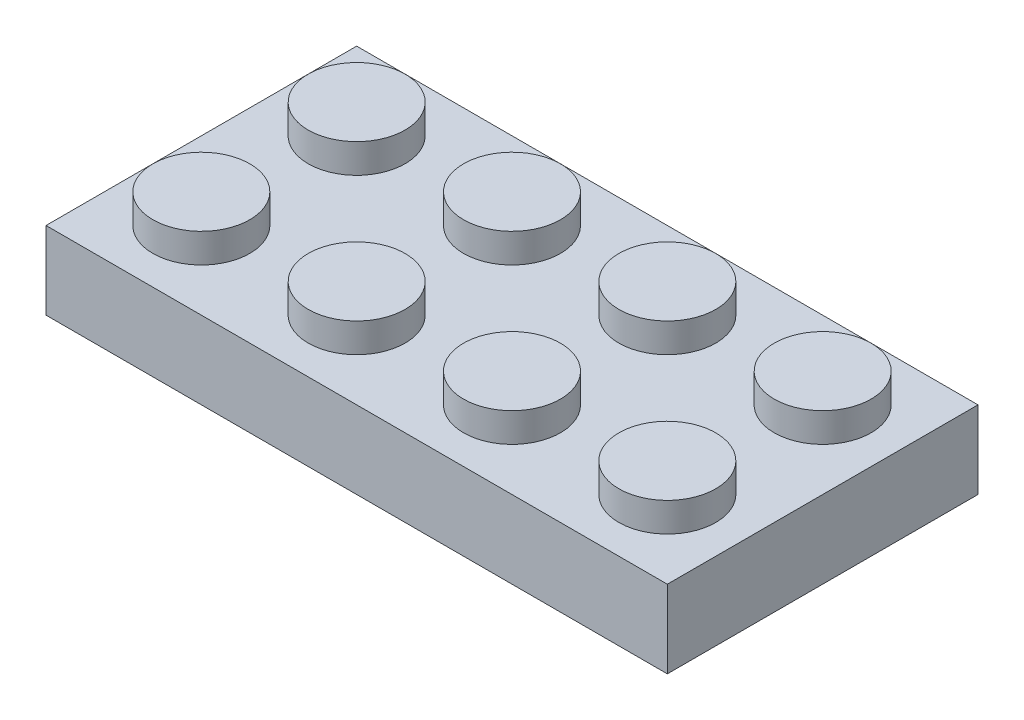
ISO-10303-21;
HEADER;
FILE_DESCRIPTION(('STEP AP214'),'2;1');
FILE_NAME('part.step','',(''),(''),'','','');
FILE_SCHEMA(('AUTOMOTIVE_DESIGN { 1 0 10303 214 1 1 1 1 }'));
ENDSEC;
DATA;
#1=APPLICATION_CONTEXT('core data for automotive mechanical design processes');
#2=APPLICATION_PROTOCOL_DEFINITION('international standard','automotive_design',2000,#1);
#3=PRODUCT_CONTEXT('',#1,'mechanical');
#4=PRODUCT('Part','Part','',(#3));
#5=PRODUCT_RELATED_PRODUCT_CATEGORY('part','',(#4));
#6=PRODUCT_DEFINITION_FORMATION('','',#4);
#7=PRODUCT_DEFINITION_CONTEXT('part definition',#1,'design');
#8=PRODUCT_DEFINITION('design','',#6,#7);
#9=PRODUCT_DEFINITION_SHAPE('','',#8);
#10=(LENGTH_UNIT() NAMED_UNIT(*) SI_UNIT(.MILLI.,.METRE.));
#11=(NAMED_UNIT(*) PLANE_ANGLE_UNIT() SI_UNIT($,.RADIAN.));
#12=(NAMED_UNIT(*) SI_UNIT($,.STERADIAN.) SOLID_ANGLE_UNIT());
#13=UNCERTAINTY_MEASURE_WITH_UNIT(LENGTH_MEASURE(1.E-05),#10,'distance_accuracy_value','');
#14=(GEOMETRIC_REPRESENTATION_CONTEXT(3) GLOBAL_UNCERTAINTY_ASSIGNED_CONTEXT((#13)) GLOBAL_UNIT_ASSIGNED_CONTEXT((#10,
#11,#12)) REPRESENTATION_CONTEXT('',''));
#15=CARTESIAN_POINT('',(0.,0.,0.));
#16=DIRECTION('',(0.,0.,1.));
#17=DIRECTION('',(1.,0.,0.));
#18=AXIS2_PLACEMENT_3D('',#15,#16,#17);
#19=CARTESIAN_POINT('',(0.,1.9812,0.));
#20=DIRECTION('',(0.,1.,0.));
#21=DIRECTION('',(0.,0.,1.));
#22=AXIS2_PLACEMENT_3D('',#19,#20,#21);
#23=PLANE('',#22);
#24=CARTESIAN_POINT('',(-9.525,1.9812,-3.175));
#25=DIRECTION('',(0.,1.,0.));
#26=DIRECTION('',(0.,0.,1.));
#27=AXIS2_PLACEMENT_3D('',#24,#25,#26);
#28=CIRCLE('',#27,0.7874);
#29=CARTESIAN_POINT('',(-9.525,1.9812,-2.3876));
#30=VERTEX_POINT('',#29);
#31=EDGE_CURVE('E173',#30,#30,#28,.T.);
#32=ORIENTED_EDGE('',*,*,#31,.T.);
#33=EDGE_LOOP('',(#32));
#34=FACE_BOUND('',#33,.T.);
#35=DIRECTION('',(0.,0.,1.));
#36=VECTOR('',#35,1.);
#37=CARTESIAN_POINT('',(-11.5062,1.9812,6.35));
#38=LINE('',#37,#36);
#39=CARTESIAN_POINT('',(-11.5062,1.9812,-5.1562));
#40=VERTEX_POINT('',#39);
#41=CARTESIAN_POINT('',(-11.5062,1.9812,5.1562));
#42=VERTEX_POINT('',#41);
#43=EDGE_CURVE('E123',#40,#42,#38,.T.);
#44=ORIENTED_EDGE('',*,*,#43,.F.);
#45=DIRECTION('',(-1.,0.,0.));
#46=VECTOR('',#45,1.);
#47=CARTESIAN_POINT('',(12.7,1.9812,-5.1562));
#48=LINE('',#47,#46);
#49=CARTESIAN_POINT('',(11.5062,1.9812,-5.1562));
#50=VERTEX_POINT('',#49);
#51=EDGE_CURVE('E131',#50,#40,#48,.T.);
#52=ORIENTED_EDGE('',*,*,#51,.F.);
#53=DIRECTION('',(0.,0.,-1.));
#54=VECTOR('',#53,1.);
#55=CARTESIAN_POINT('',(11.5062,1.9812,6.35));
#56=LINE('',#55,#54);
#57=CARTESIAN_POINT('',(11.5062,1.9812,5.1562));
#58=VERTEX_POINT('',#57);
#59=EDGE_CURVE('E122',#58,#50,#56,.T.);
#60=ORIENTED_EDGE('',*,*,#59,.F.);
#61=DIRECTION('',(1.,0.,0.));
#62=VECTOR('',#61,1.);
#63=CARTESIAN_POINT('',(12.7,1.9812,5.1562));
#64=LINE('',#63,#62);
#65=EDGE_CURVE('E112',#42,#58,#64,.T.);
#66=ORIENTED_EDGE('',*,*,#65,.F.);
#67=EDGE_LOOP('',(#44,#52,#60,#66));
#68=FACE_BOUND('',#67,.T.);
#69=CARTESIAN_POINT('',(-3.175,1.9812,-3.175));
#70=DIRECTION('',(0.,1.,0.));
#71=DIRECTION('',(0.,0.,1.));
#72=AXIS2_PLACEMENT_3D('',#69,#70,#71);
#73=CIRCLE('',#72,0.7874);
#74=CARTESIAN_POINT('',(-3.175,1.9812,-2.3876));
#75=VERTEX_POINT('',#74);
#76=EDGE_CURVE('E137',#75,#75,#73,.T.);
#77=ORIENTED_EDGE('',*,*,#76,.T.);
#78=EDGE_LOOP('',(#77));
#79=FACE_BOUND('',#78,.T.);
#80=CARTESIAN_POINT('',(3.175,1.9812,-3.175));
#81=DIRECTION('',(0.,1.,0.));
#82=DIRECTION('',(0.,0.,1.));
#83=AXIS2_PLACEMENT_3D('',#80,#81,#82);
#84=CIRCLE('',#83,0.7874);
#85=CARTESIAN_POINT('',(3.175,1.9812,-2.3876));
#86=VERTEX_POINT('',#85);
#87=EDGE_CURVE('E142',#86,#86,#84,.T.);
#88=ORIENTED_EDGE('',*,*,#87,.T.);
#89=EDGE_LOOP('',(#88));
#90=FACE_BOUND('',#89,.T.);
#91=CARTESIAN_POINT('',(9.525,1.9812,-3.175));
#92=DIRECTION('',(0.,1.,0.));
#93=DIRECTION('',(0.,0.,1.));
#94=AXIS2_PLACEMENT_3D('',#91,#92,#93);
#95=CIRCLE('',#94,0.7874);
#96=CARTESIAN_POINT('',(9.525,1.9812,-2.3876));
#97=VERTEX_POINT('',#96);
#98=EDGE_CURVE('E146',#97,#97,#95,.T.);
#99=ORIENTED_EDGE('',*,*,#98,.T.);
#100=EDGE_LOOP('',(#99));
#101=FACE_BOUND('',#100,.T.);
#102=CARTESIAN_POINT('',(-9.525,1.9812,3.175));
#103=DIRECTION('',(0.,1.,0.));
#104=DIRECTION('',(0.,0.,1.));
#105=AXIS2_PLACEMENT_3D('',#102,#103,#104);
#106=CIRCLE('',#105,0.7874);
#107=CARTESIAN_POINT('',(-9.525,1.9812,3.9624));
#108=VERTEX_POINT('',#107);
#109=EDGE_CURVE('E150',#108,#108,#106,.T.);
#110=ORIENTED_EDGE('',*,*,#109,.T.);
#111=EDGE_LOOP('',(#110));
#112=FACE_BOUND('',#111,.T.);
#113=CARTESIAN_POINT('',(-3.175,1.9812,3.175));
#114=DIRECTION('',(0.,1.,0.));
#115=DIRECTION('',(0.,0.,1.));
#116=AXIS2_PLACEMENT_3D('',#113,#114,#115);
#117=CIRCLE('',#116,0.7874);
#118=CARTESIAN_POINT('',(-3.175,1.9812,3.9624));
#119=VERTEX_POINT('',#118);
#120=EDGE_CURVE('E154',#119,#119,#117,.T.);
#121=ORIENTED_EDGE('',*,*,#120,.T.);
#122=EDGE_LOOP('',(#121));
#123=FACE_BOUND('',#122,.T.);
#124=CARTESIAN_POINT('',(3.175,1.9812,3.175));
#125=DIRECTION('',(0.,1.,0.));
#126=DIRECTION('',(0.,0.,1.));
#127=AXIS2_PLACEMENT_3D('',#124,#125,#126);
#128=CIRCLE('',#127,0.7874);
#129=CARTESIAN_POINT('',(3.175,1.9812,3.9624));
#130=VERTEX_POINT('',#129);
#131=EDGE_CURVE('E158',#130,#130,#128,.T.);
#132=ORIENTED_EDGE('',*,*,#131,.T.);
#133=EDGE_LOOP('',(#132));
#134=FACE_BOUND('',#133,.T.);
#135=CARTESIAN_POINT('',(9.525,1.9812,3.17499999999999));
#136=DIRECTION('',(0.,1.,0.));
#137=DIRECTION('',(0.,0.,1.));
#138=AXIS2_PLACEMENT_3D('',#135,#136,#137);
#139=CIRCLE('',#138,0.7874);
#140=CARTESIAN_POINT('',(9.525,1.9812,3.96239999999999));
#141=VERTEX_POINT('',#140);
#142=EDGE_CURVE('E162',#141,#141,#139,.T.);
#143=ORIENTED_EDGE('',*,*,#142,.T.);
#144=EDGE_LOOP('',(#143));
#145=FACE_BOUND('',#144,.T.);
#146=CARTESIAN_POINT('',(6.35,1.9812,0.));
#147=DIRECTION('',(0.,1.,0.));
#148=DIRECTION('',(0.,0.,1.));
#149=AXIS2_PLACEMENT_3D('',#146,#147,#148);
#150=CIRCLE('',#149,2.5019);
#151=CARTESIAN_POINT('',(6.35,1.9812,2.5019));
#152=VERTEX_POINT('',#151);
#153=EDGE_CURVE('E267',#152,#152,#150,.F.);
#154=ORIENTED_EDGE('',*,*,#153,.F.);
#155=EDGE_LOOP('',(#154));
#156=FACE_BOUND('',#155,.T.);
#157=CARTESIAN_POINT('',(0.,1.9812,0.));
#158=DIRECTION('',(0.,1.,0.));
#159=DIRECTION('',(0.,0.,1.));
#160=AXIS2_PLACEMENT_3D('',#157,#158,#159);
#161=CIRCLE('',#160,2.5019);
#162=CARTESIAN_POINT('',(0.,1.9812,2.5019));
#163=VERTEX_POINT('',#162);
#164=EDGE_CURVE('E45',#163,#163,#161,.F.);
#165=ORIENTED_EDGE('',*,*,#164,.F.);
#166=EDGE_LOOP('',(#165));
#167=FACE_BOUND('',#166,.T.);
#168=CARTESIAN_POINT('',(-6.35,1.9812,0.));
#169=DIRECTION('',(0.,1.,0.));
#170=DIRECTION('',(0.,0.,1.));
#171=AXIS2_PLACEMENT_3D('',#168,#169,#170);
#172=CIRCLE('',#171,2.5019);
#173=CARTESIAN_POINT('',(-6.35,1.9812,2.50190000000001));
#174=VERTEX_POINT('',#173);
#175=EDGE_CURVE('E11',#174,#174,#172,.F.);
#176=ORIENTED_EDGE('',*,*,#175,.F.);
#177=EDGE_LOOP('',(#176));
#178=FACE_BOUND('',#177,.T.);
#179=ADVANCED_FACE('F37',(#34,#68,#79,#90,#101,#112,#123,#134,#145,#156,#167,#178),#23,.F.);
#180=CARTESIAN_POINT('',(0.,3.175,0.));
#181=DIRECTION('',(0.,1.,0.));
#182=DIRECTION('',(0.,0.,1.));
#183=AXIS2_PLACEMENT_3D('',#180,#181,#182);
#184=PLANE('',#183);
#185=CARTESIAN_POINT('',(-9.525,3.175,-3.175));
#186=DIRECTION('',(0.,1.,0.));
#187=DIRECTION('',(0.,0.,1.));
#188=AXIS2_PLACEMENT_3D('',#185,#186,#187);
#189=CIRCLE('',#188,1.9812);
#190=CARTESIAN_POINT('',(-9.525,3.175,-1.1938));
#191=VERTEX_POINT('',#190);
#192=EDGE_CURVE('E202',#191,#191,#189,.T.);
#193=ORIENTED_EDGE('',*,*,#192,.F.);
#194=EDGE_LOOP('',(#193));
#195=FACE_BOUND('',#194,.T.);
#196=DIRECTION('',(0.,0.,1.));
#197=VECTOR('',#196,1.);
#198=CARTESIAN_POINT('',(-12.7,3.175,6.35));
#199=LINE('',#198,#197);
#200=CARTESIAN_POINT('',(-12.7,3.175,-6.35));
#201=VERTEX_POINT('',#200);
#202=CARTESIAN_POINT('',(-12.7,3.175,6.35));
#203=VERTEX_POINT('',#202);
#204=EDGE_CURVE('E209',#201,#203,#199,.T.);
#205=ORIENTED_EDGE('',*,*,#204,.T.);
#206=DIRECTION('',(1.,0.,0.));
#207=VECTOR('',#206,1.);
#208=CARTESIAN_POINT('',(12.7,3.175,6.35));
#209=LINE('',#208,#207);
#210=CARTESIAN_POINT('',(12.7,3.175,6.35));
#211=VERTEX_POINT('',#210);
#212=EDGE_CURVE('E90',#203,#211,#209,.T.);
#213=ORIENTED_EDGE('',*,*,#212,.T.);
#214=DIRECTION('',(0.,0.,-1.));
#215=VECTOR('',#214,1.);
#216=CARTESIAN_POINT('',(12.7,3.175,6.35));
#217=LINE('',#216,#215);
#218=CARTESIAN_POINT('',(12.7,3.175,-6.35));
#219=VERTEX_POINT('',#218);
#220=EDGE_CURVE('E212',#211,#219,#217,.T.);
#221=ORIENTED_EDGE('',*,*,#220,.T.);
#222=DIRECTION('',(-1.,0.,0.));
#223=VECTOR('',#222,1.);
#224=CARTESIAN_POINT('',(12.7,3.175,-6.35));
#225=LINE('',#224,#223);
#226=EDGE_CURVE('E61',#219,#201,#225,.T.);
#227=ORIENTED_EDGE('',*,*,#226,.T.);
#228=EDGE_LOOP('',(#205,#213,#221,#227));
#229=FACE_BOUND('',#228,.T.);
#230=CARTESIAN_POINT('',(-3.175,3.175,-3.175));
#231=DIRECTION('',(0.,1.,0.));
#232=DIRECTION('',(0.,0.,1.));
#233=AXIS2_PLACEMENT_3D('',#230,#231,#232);
#234=CIRCLE('',#233,1.9812);
#235=CARTESIAN_POINT('',(-3.175,3.175,-1.1938));
#236=VERTEX_POINT('',#235);
#237=EDGE_CURVE('E188',#236,#236,#234,.T.);
#238=ORIENTED_EDGE('',*,*,#237,.F.);
#239=EDGE_LOOP('',(#238));
#240=FACE_BOUND('',#239,.T.);
#241=CARTESIAN_POINT('',(3.175,3.175,-3.175));
#242=DIRECTION('',(0.,1.,0.));
#243=DIRECTION('',(0.,0.,1.));
#244=AXIS2_PLACEMENT_3D('',#241,#242,#243);
#245=CIRCLE('',#244,1.9812);
#246=CARTESIAN_POINT('',(3.175,3.175,-1.1938));
#247=VERTEX_POINT('',#246);
#248=EDGE_CURVE('E231',#247,#247,#245,.T.);
#249=ORIENTED_EDGE('',*,*,#248,.F.);
#250=EDGE_LOOP('',(#249));
#251=FACE_BOUND('',#250,.T.);
#252=CARTESIAN_POINT('',(9.525,3.175,-3.175));
#253=DIRECTION('',(0.,1.,0.));
#254=DIRECTION('',(0.,0.,1.));
#255=AXIS2_PLACEMENT_3D('',#252,#253,#254);
#256=CIRCLE('',#255,1.9812);
#257=CARTESIAN_POINT('',(9.525,3.175,-1.1938));
#258=VERTEX_POINT('',#257);
#259=EDGE_CURVE('E237',#258,#258,#256,.T.);
#260=ORIENTED_EDGE('',*,*,#259,.F.);
#261=EDGE_LOOP('',(#260));
#262=FACE_BOUND('',#261,.T.);
#263=CARTESIAN_POINT('',(-9.525,3.175,3.175));
#264=DIRECTION('',(0.,1.,0.));
#265=DIRECTION('',(0.,0.,1.));
#266=AXIS2_PLACEMENT_3D('',#263,#264,#265);
#267=CIRCLE('',#266,1.9812);
#268=CARTESIAN_POINT('',(-9.525,3.175,5.1562));
#269=VERTEX_POINT('',#268);
#270=EDGE_CURVE('E243',#269,#269,#267,.T.);
#271=ORIENTED_EDGE('',*,*,#270,.F.);
#272=EDGE_LOOP('',(#271));
#273=FACE_BOUND('',#272,.T.);
#274=CARTESIAN_POINT('',(-3.175,3.175,3.175));
#275=DIRECTION('',(0.,1.,0.));
#276=DIRECTION('',(0.,0.,1.));
#277=AXIS2_PLACEMENT_3D('',#274,#275,#276);
#278=CIRCLE('',#277,1.9812);
#279=CARTESIAN_POINT('',(-3.175,3.175,5.1562));
#280=VERTEX_POINT('',#279);
#281=EDGE_CURVE('E249',#280,#280,#278,.T.);
#282=ORIENTED_EDGE('',*,*,#281,.F.);
#283=EDGE_LOOP('',(#282));
#284=FACE_BOUND('',#283,.T.);
#285=CARTESIAN_POINT('',(3.175,3.175,3.175));
#286=DIRECTION('',(0.,1.,0.));
#287=DIRECTION('',(0.,0.,1.));
#288=AXIS2_PLACEMENT_3D('',#285,#286,#287);
#289=CIRCLE('',#288,1.9812);
#290=CARTESIAN_POINT('',(3.175,3.175,5.1562));
#291=VERTEX_POINT('',#290);
#292=EDGE_CURVE('E255',#291,#291,#289,.T.);
#293=ORIENTED_EDGE('',*,*,#292,.F.);
#294=EDGE_LOOP('',(#293));
#295=FACE_BOUND('',#294,.T.);
#296=CARTESIAN_POINT('',(9.525,3.175,3.17499999999999));
#297=DIRECTION('',(0.,1.,0.));
#298=DIRECTION('',(0.,0.,1.));
#299=AXIS2_PLACEMENT_3D('',#296,#297,#298);
#300=CIRCLE('',#299,1.9812);
#301=CARTESIAN_POINT('',(9.525,3.175,5.15619999999999));
#302=VERTEX_POINT('',#301);
#303=EDGE_CURVE('E261',#302,#302,#300,.T.);
#304=ORIENTED_EDGE('',*,*,#303,.F.);
#305=EDGE_LOOP('',(#304));
#306=FACE_BOUND('',#305,.T.);
#307=ADVANCED_FACE('F276',(#195,#229,#240,#251,#262,#273,#284,#295,#306),#184,.T.);
#308=CARTESIAN_POINT('',(-12.7,3.175,6.35));
#309=DIRECTION('',(1.,0.,0.));
#310=DIRECTION('',(0.,0.,-1.));
#311=AXIS2_PLACEMENT_3D('',#308,#309,#310);
#312=PLANE('',#311);
#313=DIRECTION('',(0.,0.,1.));
#314=VECTOR('',#313,1.);
#315=CARTESIAN_POINT('',(-12.7,0.,6.35));
#316=LINE('',#315,#314);
#317=CARTESIAN_POINT('',(-12.7,0.,-6.35));
#318=VERTEX_POINT('',#317);
#319=CARTESIAN_POINT('',(-12.7,0.,6.35));
#320=VERTEX_POINT('',#319);
#321=EDGE_CURVE('E206',#318,#320,#316,.T.);
#322=ORIENTED_EDGE('',*,*,#321,.T.);
#323=DIRECTION('',(0.,-1.,0.));
#324=VECTOR('',#323,1.);
#325=CARTESIAN_POINT('',(-12.7,3.175,6.35));
#326=LINE('',#325,#324);
#327=EDGE_CURVE('E229',#203,#320,#326,.T.);
#328=ORIENTED_EDGE('',*,*,#327,.F.);
#329=ORIENTED_EDGE('',*,*,#204,.F.);
#330=DIRECTION('',(0.,-1.,0.));
#331=VECTOR('',#330,1.);
#332=CARTESIAN_POINT('',(-12.7,3.175,-6.35));
#333=LINE('',#332,#331);
#334=EDGE_CURVE('E215',#201,#318,#333,.T.);
#335=ORIENTED_EDGE('',*,*,#334,.T.);
#336=EDGE_LOOP('',(#322,#328,#329,#335));
#337=FACE_BOUND('',#336,.T.);
#338=ADVANCED_FACE('F424',(#337),#312,.F.);
#339=CARTESIAN_POINT('',(12.7,3.175,6.35));
#340=DIRECTION('',(0.,0.,-1.));
#341=DIRECTION('',(-1.,0.,0.));
#342=AXIS2_PLACEMENT_3D('',#339,#340,#341);
#343=PLANE('',#342);
#344=DIRECTION('',(1.,0.,0.));
#345=VECTOR('',#344,1.);
#346=CARTESIAN_POINT('',(12.7,0.,6.35));
#347=LINE('',#346,#345);
#348=CARTESIAN_POINT('',(12.7,0.,6.35));
#349=VERTEX_POINT('',#348);
#350=EDGE_CURVE('E218',#320,#349,#347,.T.);
#351=ORIENTED_EDGE('',*,*,#350,.T.);
#352=DIRECTION('',(0.,-1.,0.));
#353=VECTOR('',#352,1.);
#354=CARTESIAN_POINT('',(12.7,3.175,6.35));
#355=LINE('',#354,#353);
#356=EDGE_CURVE('E226',#211,#349,#355,.T.);
#357=ORIENTED_EDGE('',*,*,#356,.F.);
#358=ORIENTED_EDGE('',*,*,#212,.F.);
#359=ORIENTED_EDGE('',*,*,#327,.T.);
#360=EDGE_LOOP('',(#351,#357,#358,#359));
#361=FACE_BOUND('',#360,.T.);
#362=ADVANCED_FACE('F435',(#361),#343,.F.);
#363=CARTESIAN_POINT('',(12.7,3.175,6.35));
#364=DIRECTION('',(-1.,0.,0.));
#365=DIRECTION('',(0.,0.,1.));
#366=AXIS2_PLACEMENT_3D('',#363,#364,#365);
#367=PLANE('',#366);
#368=DIRECTION('',(0.,0.,-1.));
#369=VECTOR('',#368,1.);
#370=CARTESIAN_POINT('',(12.7,0.,6.35));
#371=LINE('',#370,#369);
#372=CARTESIAN_POINT('',(12.7,0.,-6.35));
#373=VERTEX_POINT('',#372);
#374=EDGE_CURVE('E220',#349,#373,#371,.T.);
#375=ORIENTED_EDGE('',*,*,#374,.T.);
#376=DIRECTION('',(0.,-1.,0.));
#377=VECTOR('',#376,1.);
#378=CARTESIAN_POINT('',(12.7,3.175,-6.35));
#379=LINE('',#378,#377);
#380=EDGE_CURVE('E224',#219,#373,#379,.T.);
#381=ORIENTED_EDGE('',*,*,#380,.F.);
#382=ORIENTED_EDGE('',*,*,#220,.F.);
#383=ORIENTED_EDGE('',*,*,#356,.T.);
#384=EDGE_LOOP('',(#375,#381,#382,#383));
#385=FACE_BOUND('',#384,.T.);
#386=ADVANCED_FACE('F432',(#385),#367,.F.);
#387=CARTESIAN_POINT('',(12.7,3.175,-6.35));
#388=DIRECTION('',(0.,0.,1.));
#389=DIRECTION('',(1.,0.,0.));
#390=AXIS2_PLACEMENT_3D('',#387,#388,#389);
#391=PLANE('',#390);
#392=DIRECTION('',(-1.,0.,0.));
#393=VECTOR('',#392,1.);
#394=CARTESIAN_POINT('',(12.7,0.,-6.35));
#395=LINE('',#394,#393);
#396=EDGE_CURVE('E82',#373,#318,#395,.T.);
#397=ORIENTED_EDGE('',*,*,#396,.T.);
#398=ORIENTED_EDGE('',*,*,#334,.F.);
#399=ORIENTED_EDGE('',*,*,#226,.F.);
#400=ORIENTED_EDGE('',*,*,#380,.T.);
#401=EDGE_LOOP('',(#397,#398,#399,#400));
#402=FACE_BOUND('',#401,.T.);
#403=ADVANCED_FACE('F428',(#402),#391,.F.);
#404=CARTESIAN_POINT('',(0.,0.,0.));
#405=DIRECTION('',(0.,1.,0.));
#406=DIRECTION('',(0.,0.,1.));
#407=AXIS2_PLACEMENT_3D('',#404,#405,#406);
#408=PLANE('',#407);
#409=DIRECTION('',(-1.,0.,0.));
#410=VECTOR('',#409,1.);
#411=CARTESIAN_POINT('',(12.7,0.,-5.1562));
#412=LINE('',#411,#410);
#413=CARTESIAN_POINT('',(11.5062,0.,-5.1562));
#414=VERTEX_POINT('',#413);
#415=CARTESIAN_POINT('',(-11.5062,0.,-5.1562));
#416=VERTEX_POINT('',#415);
#417=EDGE_CURVE('E192',#414,#416,#412,.T.);
#418=ORIENTED_EDGE('',*,*,#417,.T.);
#419=DIRECTION('',(0.,0.,1.));
#420=VECTOR('',#419,1.);
#421=CARTESIAN_POINT('',(-11.5062,0.,6.35));
#422=LINE('',#421,#420);
#423=CARTESIAN_POINT('',(-11.5062,0.,5.1562));
#424=VERTEX_POINT('',#423);
#425=EDGE_CURVE('E172',#416,#424,#422,.T.);
#426=ORIENTED_EDGE('',*,*,#425,.T.);
#427=DIRECTION('',(1.,0.,0.));
#428=VECTOR('',#427,1.);
#429=CARTESIAN_POINT('',(12.7,0.,5.1562));
#430=LINE('',#429,#428);
#431=CARTESIAN_POINT('',(11.5062,0.,5.1562));
#432=VERTEX_POINT('',#431);
#433=EDGE_CURVE('E191',#424,#432,#430,.T.);
#434=ORIENTED_EDGE('',*,*,#433,.T.);
#435=DIRECTION('',(0.,0.,-1.));
#436=VECTOR('',#435,1.);
#437=CARTESIAN_POINT('',(11.5062,0.,6.35));
#438=LINE('',#437,#436);
#439=EDGE_CURVE('E52',#432,#414,#438,.T.);
#440=ORIENTED_EDGE('',*,*,#439,.T.);
#441=EDGE_LOOP('',(#418,#426,#434,#440));
#442=FACE_BOUND('',#441,.T.);
#443=ORIENTED_EDGE('',*,*,#321,.F.);
#444=ORIENTED_EDGE('',*,*,#396,.F.);
#445=ORIENTED_EDGE('',*,*,#374,.F.);
#446=ORIENTED_EDGE('',*,*,#350,.F.);
#447=EDGE_LOOP('',(#443,#444,#445,#446));
#448=FACE_BOUND('',#447,.T.);
#449=ADVANCED_FACE('F420',(#442,#448),#408,.F.);
#450=CARTESIAN_POINT('',(-9.525,4.3688,-3.175));
#451=DIRECTION('',(0.,-1.,0.));
#452=DIRECTION('',(0.,0.,-1.));
#453=AXIS2_PLACEMENT_3D('',#450,#451,#452);
#454=CYLINDRICAL_SURFACE('',#453,1.9812);
#455=CARTESIAN_POINT('',(-9.525,4.3688,-3.175));
#456=DIRECTION('',(0.,1.,0.));
#457=DIRECTION('',(0.,0.,1.));
#458=AXIS2_PLACEMENT_3D('',#455,#456,#457);
#459=CIRCLE('',#458,1.9812);
#460=CARTESIAN_POINT('',(-9.525,4.3688,-1.1938));
#461=VERTEX_POINT('',#460);
#462=EDGE_CURVE('E203',#461,#461,#459,.T.);
#463=ORIENTED_EDGE('',*,*,#462,.F.);
#464=EDGE_LOOP('',(#463));
#465=FACE_BOUND('',#464,.T.);
#466=ORIENTED_EDGE('',*,*,#192,.T.);
#467=EDGE_LOOP('',(#466));
#468=FACE_BOUND('',#467,.T.);
#469=ADVANCED_FACE('F416',(#465,#468),#454,.T.);
#470=CARTESIAN_POINT('',(-9.525,4.3688,-3.175));
#471=DIRECTION('',(0.,1.,0.));
#472=DIRECTION('',(0.,0.,1.));
#473=AXIS2_PLACEMENT_3D('',#470,#471,#472);
#474=PLANE('',#473);
#475=ORIENTED_EDGE('',*,*,#462,.T.);
#476=EDGE_LOOP('',(#475));
#477=FACE_BOUND('',#476,.T.);
#478=ADVANCED_FACE('F412',(#477),#474,.T.);
#479=CARTESIAN_POINT('',(-3.175,4.3688,-3.175));
#480=DIRECTION('',(0.,-1.,0.));
#481=DIRECTION('',(0.,0.,-1.));
#482=AXIS2_PLACEMENT_3D('',#479,#480,#481);
#483=CYLINDRICAL_SURFACE('',#482,1.9812);
#484=CARTESIAN_POINT('',(-3.175,4.3688,-3.175));
#485=DIRECTION('',(0.,1.,0.));
#486=DIRECTION('',(0.,0.,1.));
#487=AXIS2_PLACEMENT_3D('',#484,#485,#486);
#488=CIRCLE('',#487,1.9812);
#489=CARTESIAN_POINT('',(-3.175,4.3688,-1.1938));
#490=VERTEX_POINT('',#489);
#491=EDGE_CURVE('E199',#490,#490,#488,.T.);
#492=ORIENTED_EDGE('',*,*,#491,.F.);
#493=EDGE_LOOP('',(#492));
#494=FACE_BOUND('',#493,.T.);
#495=ORIENTED_EDGE('',*,*,#237,.T.);
#496=EDGE_LOOP('',(#495));
#497=FACE_BOUND('',#496,.T.);
#498=ADVANCED_FACE('F408',(#494,#497),#483,.T.);
#499=CARTESIAN_POINT('',(-3.175,4.3688,-3.175));
#500=DIRECTION('',(0.,1.,0.));
#501=DIRECTION('',(0.,0.,1.));
#502=AXIS2_PLACEMENT_3D('',#499,#500,#501);
#503=PLANE('',#502);
#504=ORIENTED_EDGE('',*,*,#491,.T.);
#505=EDGE_LOOP('',(#504));
#506=FACE_BOUND('',#505,.T.);
#507=ADVANCED_FACE('F404',(#506),#503,.T.);
#508=CARTESIAN_POINT('',(3.175,4.3688,-3.175));
#509=DIRECTION('',(0.,1.,0.));
#510=DIRECTION('',(0.,0.,1.));
#511=AXIS2_PLACEMENT_3D('',#508,#509,#510);
#512=PLANE('',#511);
#513=CARTESIAN_POINT('',(3.175,4.3688,-3.175));
#514=DIRECTION('',(0.,1.,0.));
#515=DIRECTION('',(0.,0.,1.));
#516=AXIS2_PLACEMENT_3D('',#513,#514,#515);
#517=CIRCLE('',#516,1.9812);
#518=CARTESIAN_POINT('',(3.175,4.3688,-1.1938));
#519=VERTEX_POINT('',#518);
#520=EDGE_CURVE('E234',#519,#519,#517,.T.);
#521=ORIENTED_EDGE('',*,*,#520,.T.);
#522=EDGE_LOOP('',(#521));
#523=FACE_BOUND('',#522,.T.);
#524=ADVANCED_FACE('F407',(#523),#512,.T.);
#525=CARTESIAN_POINT('',(3.175,4.3688,-3.175));
#526=DIRECTION('',(0.,-1.,0.));
#527=DIRECTION('',(0.,0.,-1.));
#528=AXIS2_PLACEMENT_3D('',#525,#526,#527);
#529=CYLINDRICAL_SURFACE('',#528,1.9812);
#530=ORIENTED_EDGE('',*,*,#520,.F.);
#531=EDGE_LOOP('',(#530));
#532=FACE_BOUND('',#531,.T.);
#533=ORIENTED_EDGE('',*,*,#248,.T.);
#534=EDGE_LOOP('',(#533));
#535=FACE_BOUND('',#534,.T.);
#536=ADVANCED_FACE('F442',(#532,#535),#529,.T.);
#537=CARTESIAN_POINT('',(9.525,4.3688,-3.175));
#538=DIRECTION('',(0.,1.,0.));
#539=DIRECTION('',(0.,0.,1.));
#540=AXIS2_PLACEMENT_3D('',#537,#538,#539);
#541=PLANE('',#540);
#542=CARTESIAN_POINT('',(9.525,4.3688,-3.175));
#543=DIRECTION('',(0.,1.,0.));
#544=DIRECTION('',(0.,0.,1.));
#545=AXIS2_PLACEMENT_3D('',#542,#543,#544);
#546=CIRCLE('',#545,1.9812);
#547=CARTESIAN_POINT('',(9.525,4.3688,-1.1938));
#548=VERTEX_POINT('',#547);
#549=EDGE_CURVE('E240',#548,#548,#546,.T.);
#550=ORIENTED_EDGE('',*,*,#549,.T.);
#551=EDGE_LOOP('',(#550));
#552=FACE_BOUND('',#551,.T.);
#553=ADVANCED_FACE('F445',(#552),#541,.T.);
#554=CARTESIAN_POINT('',(9.525,4.3688,-3.175));
#555=DIRECTION('',(0.,-1.,0.));
#556=DIRECTION('',(0.,0.,-1.));
#557=AXIS2_PLACEMENT_3D('',#554,#555,#556);
#558=CYLINDRICAL_SURFACE('',#557,1.9812);
#559=ORIENTED_EDGE('',*,*,#549,.F.);
#560=EDGE_LOOP('',(#559));
#561=FACE_BOUND('',#560,.T.);
#562=ORIENTED_EDGE('',*,*,#259,.T.);
#563=EDGE_LOOP('',(#562));
#564=FACE_BOUND('',#563,.T.);
#565=ADVANCED_FACE('F450',(#561,#564),#558,.T.);
#566=CARTESIAN_POINT('',(-9.525,4.3688,3.175));
#567=DIRECTION('',(0.,1.,0.));
#568=DIRECTION('',(0.,0.,1.));
#569=AXIS2_PLACEMENT_3D('',#566,#567,#568);
#570=PLANE('',#569);
#571=CARTESIAN_POINT('',(-9.525,4.3688,3.175));
#572=DIRECTION('',(0.,1.,0.));
#573=DIRECTION('',(0.,0.,1.));
#574=AXIS2_PLACEMENT_3D('',#571,#572,#573);
#575=CIRCLE('',#574,1.9812);
#576=CARTESIAN_POINT('',(-9.525,4.3688,5.1562));
#577=VERTEX_POINT('',#576);
#578=EDGE_CURVE('E246',#577,#577,#575,.T.);
#579=ORIENTED_EDGE('',*,*,#578,.T.);
#580=EDGE_LOOP('',(#579));
#581=FACE_BOUND('',#580,.T.);
#582=ADVANCED_FACE('F453',(#581),#570,.T.);
#583=CARTESIAN_POINT('',(-9.525,4.3688,3.175));
#584=DIRECTION('',(0.,-1.,0.));
#585=DIRECTION('',(0.,0.,-1.));
#586=AXIS2_PLACEMENT_3D('',#583,#584,#585);
#587=CYLINDRICAL_SURFACE('',#586,1.9812);
#588=ORIENTED_EDGE('',*,*,#578,.F.);
#589=EDGE_LOOP('',(#588));
#590=FACE_BOUND('',#589,.T.);
#591=ORIENTED_EDGE('',*,*,#270,.T.);
#592=EDGE_LOOP('',(#591));
#593=FACE_BOUND('',#592,.T.);
#594=ADVANCED_FACE('F458',(#590,#593),#587,.T.);
#595=CARTESIAN_POINT('',(-3.175,4.3688,3.175));
#596=DIRECTION('',(0.,1.,0.));
#597=DIRECTION('',(0.,0.,1.));
#598=AXIS2_PLACEMENT_3D('',#595,#596,#597);
#599=PLANE('',#598);
#600=CARTESIAN_POINT('',(-3.175,4.3688,3.175));
#601=DIRECTION('',(0.,1.,0.));
#602=DIRECTION('',(0.,0.,1.));
#603=AXIS2_PLACEMENT_3D('',#600,#601,#602);
#604=CIRCLE('',#603,1.9812);
#605=CARTESIAN_POINT('',(-3.175,4.3688,5.1562));
#606=VERTEX_POINT('',#605);
#607=EDGE_CURVE('E252',#606,#606,#604,.T.);
#608=ORIENTED_EDGE('',*,*,#607,.T.);
#609=EDGE_LOOP('',(#608));
#610=FACE_BOUND('',#609,.T.);
#611=ADVANCED_FACE('F461',(#610),#599,.T.);
#612=CARTESIAN_POINT('',(-3.175,4.3688,3.175));
#613=DIRECTION('',(0.,-1.,0.));
#614=DIRECTION('',(0.,0.,-1.));
#615=AXIS2_PLACEMENT_3D('',#612,#613,#614);
#616=CYLINDRICAL_SURFACE('',#615,1.9812);
#617=ORIENTED_EDGE('',*,*,#607,.F.);
#618=EDGE_LOOP('',(#617));
#619=FACE_BOUND('',#618,.T.);
#620=ORIENTED_EDGE('',*,*,#281,.T.);
#621=EDGE_LOOP('',(#620));
#622=FACE_BOUND('',#621,.T.);
#623=ADVANCED_FACE('F466',(#619,#622),#616,.T.);
#624=CARTESIAN_POINT('',(3.175,4.3688,3.175));
#625=DIRECTION('',(0.,1.,0.));
#626=DIRECTION('',(0.,0.,1.));
#627=AXIS2_PLACEMENT_3D('',#624,#625,#626);
#628=PLANE('',#627);
#629=CARTESIAN_POINT('',(3.175,4.3688,3.175));
#630=DIRECTION('',(0.,1.,0.));
#631=DIRECTION('',(0.,0.,1.));
#632=AXIS2_PLACEMENT_3D('',#629,#630,#631);
#633=CIRCLE('',#632,1.9812);
#634=CARTESIAN_POINT('',(3.175,4.3688,5.1562));
#635=VERTEX_POINT('',#634);
#636=EDGE_CURVE('E258',#635,#635,#633,.T.);
#637=ORIENTED_EDGE('',*,*,#636,.T.);
#638=EDGE_LOOP('',(#637));
#639=FACE_BOUND('',#638,.T.);
#640=ADVANCED_FACE('F469',(#639),#628,.T.);
#641=CARTESIAN_POINT('',(3.175,4.3688,3.175));
#642=DIRECTION('',(0.,-1.,0.));
#643=DIRECTION('',(0.,0.,-1.));
#644=AXIS2_PLACEMENT_3D('',#641,#642,#643);
#645=CYLINDRICAL_SURFACE('',#644,1.9812);
#646=ORIENTED_EDGE('',*,*,#636,.F.);
#647=EDGE_LOOP('',(#646));
#648=FACE_BOUND('',#647,.T.);
#649=ORIENTED_EDGE('',*,*,#292,.T.);
#650=EDGE_LOOP('',(#649));
#651=FACE_BOUND('',#650,.T.);
#652=ADVANCED_FACE('F474',(#648,#651),#645,.T.);
#653=CARTESIAN_POINT('',(9.525,4.3688,3.17499999999999));
#654=DIRECTION('',(0.,1.,0.));
#655=DIRECTION('',(0.,0.,1.));
#656=AXIS2_PLACEMENT_3D('',#653,#654,#655);
#657=PLANE('',#656);
#658=CARTESIAN_POINT('',(9.525,4.3688,3.17499999999999));
#659=DIRECTION('',(0.,1.,0.));
#660=DIRECTION('',(0.,0.,1.));
#661=AXIS2_PLACEMENT_3D('',#658,#659,#660);
#662=CIRCLE('',#661,1.9812);
#663=CARTESIAN_POINT('',(9.525,4.3688,5.15619999999999));
#664=VERTEX_POINT('',#663);
#665=EDGE_CURVE('E264',#664,#664,#662,.T.);
#666=ORIENTED_EDGE('',*,*,#665,.T.);
#667=EDGE_LOOP('',(#666));
#668=FACE_BOUND('',#667,.T.);
#669=ADVANCED_FACE('F39',(#668),#657,.T.);
#670=CARTESIAN_POINT('',(9.525,4.3688,3.17499999999999));
#671=DIRECTION('',(0.,-1.,0.));
#672=DIRECTION('',(0.,0.,-1.));
#673=AXIS2_PLACEMENT_3D('',#670,#671,#672);
#674=CYLINDRICAL_SURFACE('',#673,1.9812);
#675=ORIENTED_EDGE('',*,*,#665,.F.);
#676=EDGE_LOOP('',(#675));
#677=FACE_BOUND('',#676,.T.);
#678=ORIENTED_EDGE('',*,*,#303,.T.);
#679=EDGE_LOOP('',(#678));
#680=FACE_BOUND('',#679,.T.);
#681=ADVANCED_FACE('F331',(#677,#680),#674,.T.);
#682=CARTESIAN_POINT('',(-11.5062,3.175,6.35));
#683=DIRECTION('',(1.,0.,0.));
#684=DIRECTION('',(0.,0.,-1.));
#685=AXIS2_PLACEMENT_3D('',#682,#683,#684);
#686=PLANE('',#685);
#687=ORIENTED_EDGE('',*,*,#425,.F.);
#688=DIRECTION('',(0.,-1.,0.));
#689=VECTOR('',#688,1.);
#690=CARTESIAN_POINT('',(-11.5062,3.175,-5.1562));
#691=LINE('',#690,#689);
#692=EDGE_CURVE('E133',#40,#416,#691,.T.);
#693=ORIENTED_EDGE('',*,*,#692,.F.);
#694=ORIENTED_EDGE('',*,*,#43,.T.);
#695=DIRECTION('',(0.,-1.,0.));
#696=VECTOR('',#695,1.);
#697=CARTESIAN_POINT('',(-11.5062,3.175,5.1562));
#698=LINE('',#697,#696);
#699=EDGE_CURVE('E117',#42,#424,#698,.T.);
#700=ORIENTED_EDGE('',*,*,#699,.T.);
#701=EDGE_LOOP('',(#687,#693,#694,#700));
#702=FACE_BOUND('',#701,.T.);
#703=ADVANCED_FACE('F328',(#702),#686,.T.);
#704=CARTESIAN_POINT('',(12.7,3.175,5.1562));
#705=DIRECTION('',(0.,0.,-1.));
#706=DIRECTION('',(-1.,0.,0.));
#707=AXIS2_PLACEMENT_3D('',#704,#705,#706);
#708=PLANE('',#707);
#709=ORIENTED_EDGE('',*,*,#433,.F.);
#710=ORIENTED_EDGE('',*,*,#699,.F.);
#711=ORIENTED_EDGE('',*,*,#65,.T.);
#712=DIRECTION('',(0.,-1.,0.));
#713=VECTOR('',#712,1.);
#714=CARTESIAN_POINT('',(11.5062,3.175,5.1562));
#715=LINE('',#714,#713);
#716=EDGE_CURVE('E114',#58,#432,#715,.T.);
#717=ORIENTED_EDGE('',*,*,#716,.T.);
#718=EDGE_LOOP('',(#709,#710,#711,#717));
#719=FACE_BOUND('',#718,.T.);
#720=ADVANCED_FACE('F113',(#719),#708,.T.);
#721=CARTESIAN_POINT('',(11.5062,3.175,6.35));
#722=DIRECTION('',(-1.,0.,0.));
#723=DIRECTION('',(0.,0.,1.));
#724=AXIS2_PLACEMENT_3D('',#721,#722,#723);
#725=PLANE('',#724);
#726=ORIENTED_EDGE('',*,*,#439,.F.);
#727=ORIENTED_EDGE('',*,*,#716,.F.);
#728=ORIENTED_EDGE('',*,*,#59,.T.);
#729=DIRECTION('',(0.,-1.,0.));
#730=VECTOR('',#729,1.);
#731=CARTESIAN_POINT('',(11.5062,3.175,-5.1562));
#732=LINE('',#731,#730);
#733=EDGE_CURVE('E127',#50,#414,#732,.T.);
#734=ORIENTED_EDGE('',*,*,#733,.T.);
#735=EDGE_LOOP('',(#726,#727,#728,#734));
#736=FACE_BOUND('',#735,.T.);
#737=ADVANCED_FACE('F125',(#736),#725,.T.);
#738=CARTESIAN_POINT('',(12.7,3.175,-5.1562));
#739=DIRECTION('',(0.,0.,1.));
#740=DIRECTION('',(1.,0.,0.));
#741=AXIS2_PLACEMENT_3D('',#738,#739,#740);
#742=PLANE('',#741);
#743=ORIENTED_EDGE('',*,*,#417,.F.);
#744=ORIENTED_EDGE('',*,*,#733,.F.);
#745=ORIENTED_EDGE('',*,*,#51,.T.);
#746=ORIENTED_EDGE('',*,*,#692,.T.);
#747=EDGE_LOOP('',(#743,#744,#745,#746));
#748=FACE_BOUND('',#747,.T.);
#749=ADVANCED_FACE('F337',(#748),#742,.T.);
#750=CARTESIAN_POINT('',(-9.525,4.3688,-3.175));
#751=DIRECTION('',(0.,-1.,0.));
#752=DIRECTION('',(0.,0.,-1.));
#753=AXIS2_PLACEMENT_3D('',#750,#751,#752);
#754=CYLINDRICAL_SURFACE('',#753,0.7874);
#755=CARTESIAN_POINT('',(-9.525,3.175,-3.175));
#756=DIRECTION('',(0.,1.,0.));
#757=DIRECTION('',(0.,0.,1.));
#758=AXIS2_PLACEMENT_3D('',#755,#756,#757);
#759=CIRCLE('',#758,0.7874);
#760=CARTESIAN_POINT('',(-9.525,3.175,-2.3876));
#761=VERTEX_POINT('',#760);
#762=EDGE_CURVE('E169',#761,#761,#759,.T.);
#763=ORIENTED_EDGE('',*,*,#762,.T.);
#764=EDGE_LOOP('',(#763));
#765=FACE_BOUND('',#764,.T.);
#766=ORIENTED_EDGE('',*,*,#31,.F.);
#767=EDGE_LOOP('',(#766));
#768=FACE_BOUND('',#767,.T.);
#769=ADVANCED_FACE('F340',(#765,#768),#754,.F.);
#770=CARTESIAN_POINT('',(-9.525,3.175,-3.175));
#771=DIRECTION('',(0.,1.,0.));
#772=DIRECTION('',(0.,0.,1.));
#773=AXIS2_PLACEMENT_3D('',#770,#771,#772);
#774=PLANE('',#773);
#775=ORIENTED_EDGE('',*,*,#762,.F.);
#776=EDGE_LOOP('',(#775));
#777=FACE_BOUND('',#776,.T.);
#778=ADVANCED_FACE('F344',(#777),#774,.F.);
#779=CARTESIAN_POINT('',(-3.175,4.3688,-3.175));
#780=DIRECTION('',(0.,-1.,0.));
#781=DIRECTION('',(0.,0.,-1.));
#782=AXIS2_PLACEMENT_3D('',#779,#780,#781);
#783=CYLINDRICAL_SURFACE('',#782,0.7874);
#784=CARTESIAN_POINT('',(-3.175,3.175,-3.175));
#785=DIRECTION('',(0.,1.,0.));
#786=DIRECTION('',(0.,0.,1.));
#787=AXIS2_PLACEMENT_3D('',#784,#785,#786);
#788=CIRCLE('',#787,0.7874);
#789=CARTESIAN_POINT('',(-3.175,3.175,-2.3876));
#790=VERTEX_POINT('',#789);
#791=EDGE_CURVE('E140',#790,#790,#788,.T.);
#792=ORIENTED_EDGE('',*,*,#791,.T.);
#793=EDGE_LOOP('',(#792));
#794=FACE_BOUND('',#793,.T.);
#795=ORIENTED_EDGE('',*,*,#76,.F.);
#796=EDGE_LOOP('',(#795));
#797=FACE_BOUND('',#796,.T.);
#798=ADVANCED_FACE('F348',(#794,#797),#783,.F.);
#799=CARTESIAN_POINT('',(-3.175,3.175,-3.175));
#800=DIRECTION('',(0.,1.,0.));
#801=DIRECTION('',(0.,0.,1.));
#802=AXIS2_PLACEMENT_3D('',#799,#800,#801);
#803=PLANE('',#802);
#804=ORIENTED_EDGE('',*,*,#791,.F.);
#805=EDGE_LOOP('',(#804));
#806=FACE_BOUND('',#805,.T.);
#807=ADVANCED_FACE('F352',(#806),#803,.F.);
#808=CARTESIAN_POINT('',(3.175,3.175,-3.175));
#809=DIRECTION('',(0.,1.,0.));
#810=DIRECTION('',(0.,0.,1.));
#811=AXIS2_PLACEMENT_3D('',#808,#809,#810);
#812=PLANE('',#811);
#813=CARTESIAN_POINT('',(3.175,3.175,-3.175));
#814=DIRECTION('',(0.,1.,0.));
#815=DIRECTION('',(0.,0.,1.));
#816=AXIS2_PLACEMENT_3D('',#813,#814,#815);
#817=CIRCLE('',#816,0.7874);
#818=CARTESIAN_POINT('',(3.175,3.175,-2.3876));
#819=VERTEX_POINT('',#818);
#820=EDGE_CURVE('E145',#819,#819,#817,.T.);
#821=ORIENTED_EDGE('',*,*,#820,.F.);
#822=EDGE_LOOP('',(#821));
#823=FACE_BOUND('',#822,.T.);
#824=ADVANCED_FACE('F356',(#823),#812,.F.);
#825=CARTESIAN_POINT('',(3.175,4.3688,-3.175));
#826=DIRECTION('',(0.,-1.,0.));
#827=DIRECTION('',(0.,0.,-1.));
#828=AXIS2_PLACEMENT_3D('',#825,#826,#827);
#829=CYLINDRICAL_SURFACE('',#828,0.7874);
#830=ORIENTED_EDGE('',*,*,#820,.T.);
#831=EDGE_LOOP('',(#830));
#832=FACE_BOUND('',#831,.T.);
#833=ORIENTED_EDGE('',*,*,#87,.F.);
#834=EDGE_LOOP('',(#833));
#835=FACE_BOUND('',#834,.T.);
#836=ADVANCED_FACE('F360',(#832,#835),#829,.F.);
#837=CARTESIAN_POINT('',(9.525,3.175,-3.175));
#838=DIRECTION('',(0.,1.,0.));
#839=DIRECTION('',(0.,0.,1.));
#840=AXIS2_PLACEMENT_3D('',#837,#838,#839);
#841=PLANE('',#840);
#842=CARTESIAN_POINT('',(9.525,3.175,-3.175));
#843=DIRECTION('',(0.,1.,0.));
#844=DIRECTION('',(0.,0.,1.));
#845=AXIS2_PLACEMENT_3D('',#842,#843,#844);
#846=CIRCLE('',#845,0.7874);
#847=CARTESIAN_POINT('',(9.525,3.175,-2.3876));
#848=VERTEX_POINT('',#847);
#849=EDGE_CURVE('E149',#848,#848,#846,.T.);
#850=ORIENTED_EDGE('',*,*,#849,.F.);
#851=EDGE_LOOP('',(#850));
#852=FACE_BOUND('',#851,.T.);
#853=ADVANCED_FACE('F364',(#852),#841,.F.);
#854=CARTESIAN_POINT('',(9.525,4.3688,-3.175));
#855=DIRECTION('',(0.,-1.,0.));
#856=DIRECTION('',(0.,0.,-1.));
#857=AXIS2_PLACEMENT_3D('',#854,#855,#856);
#858=CYLINDRICAL_SURFACE('',#857,0.7874);
#859=ORIENTED_EDGE('',*,*,#849,.T.);
#860=EDGE_LOOP('',(#859));
#861=FACE_BOUND('',#860,.T.);
#862=ORIENTED_EDGE('',*,*,#98,.F.);
#863=EDGE_LOOP('',(#862));
#864=FACE_BOUND('',#863,.T.);
#865=ADVANCED_FACE('F368',(#861,#864),#858,.F.);
#866=CARTESIAN_POINT('',(-9.525,3.175,3.175));
#867=DIRECTION('',(0.,1.,0.));
#868=DIRECTION('',(0.,0.,1.));
#869=AXIS2_PLACEMENT_3D('',#866,#867,#868);
#870=PLANE('',#869);
#871=CARTESIAN_POINT('',(-9.525,3.175,3.175));
#872=DIRECTION('',(0.,1.,0.));
#873=DIRECTION('',(0.,0.,1.));
#874=AXIS2_PLACEMENT_3D('',#871,#872,#873);
#875=CIRCLE('',#874,0.7874);
#876=CARTESIAN_POINT('',(-9.525,3.175,3.9624));
#877=VERTEX_POINT('',#876);
#878=EDGE_CURVE('E153',#877,#877,#875,.T.);
#879=ORIENTED_EDGE('',*,*,#878,.F.);
#880=EDGE_LOOP('',(#879));
#881=FACE_BOUND('',#880,.T.);
#882=ADVANCED_FACE('F372',(#881),#870,.F.);
#883=CARTESIAN_POINT('',(-9.525,4.3688,3.175));
#884=DIRECTION('',(0.,-1.,0.));
#885=DIRECTION('',(0.,0.,-1.));
#886=AXIS2_PLACEMENT_3D('',#883,#884,#885);
#887=CYLINDRICAL_SURFACE('',#886,0.7874);
#888=ORIENTED_EDGE('',*,*,#878,.T.);
#889=EDGE_LOOP('',(#888));
#890=FACE_BOUND('',#889,.T.);
#891=ORIENTED_EDGE('',*,*,#109,.F.);
#892=EDGE_LOOP('',(#891));
#893=FACE_BOUND('',#892,.T.);
#894=ADVANCED_FACE('F376',(#890,#893),#887,.F.);
#895=CARTESIAN_POINT('',(-3.175,3.175,3.175));
#896=DIRECTION('',(0.,1.,0.));
#897=DIRECTION('',(0.,0.,1.));
#898=AXIS2_PLACEMENT_3D('',#895,#896,#897);
#899=PLANE('',#898);
#900=CARTESIAN_POINT('',(-3.175,3.175,3.175));
#901=DIRECTION('',(0.,1.,0.));
#902=DIRECTION('',(0.,0.,1.));
#903=AXIS2_PLACEMENT_3D('',#900,#901,#902);
#904=CIRCLE('',#903,0.7874);
#905=CARTESIAN_POINT('',(-3.175,3.175,3.9624));
#906=VERTEX_POINT('',#905);
#907=EDGE_CURVE('E157',#906,#906,#904,.T.);
#908=ORIENTED_EDGE('',*,*,#907,.F.);
#909=EDGE_LOOP('',(#908));
#910=FACE_BOUND('',#909,.T.);
#911=ADVANCED_FACE('F380',(#910),#899,.F.);
#912=CARTESIAN_POINT('',(-3.175,4.3688,3.175));
#913=DIRECTION('',(0.,-1.,0.));
#914=DIRECTION('',(0.,0.,-1.));
#915=AXIS2_PLACEMENT_3D('',#912,#913,#914);
#916=CYLINDRICAL_SURFACE('',#915,0.7874);
#917=ORIENTED_EDGE('',*,*,#907,.T.);
#918=EDGE_LOOP('',(#917));
#919=FACE_BOUND('',#918,.T.);
#920=ORIENTED_EDGE('',*,*,#120,.F.);
#921=EDGE_LOOP('',(#920));
#922=FACE_BOUND('',#921,.T.);
#923=ADVANCED_FACE('F384',(#919,#922),#916,.F.);
#924=CARTESIAN_POINT('',(3.175,3.175,3.175));
#925=DIRECTION('',(0.,1.,0.));
#926=DIRECTION('',(0.,0.,1.));
#927=AXIS2_PLACEMENT_3D('',#924,#925,#926);
#928=PLANE('',#927);
#929=CARTESIAN_POINT('',(3.175,3.175,3.175));
#930=DIRECTION('',(0.,1.,0.));
#931=DIRECTION('',(0.,0.,1.));
#932=AXIS2_PLACEMENT_3D('',#929,#930,#931);
#933=CIRCLE('',#932,0.7874);
#934=CARTESIAN_POINT('',(3.175,3.175,3.9624));
#935=VERTEX_POINT('',#934);
#936=EDGE_CURVE('E161',#935,#935,#933,.T.);
#937=ORIENTED_EDGE('',*,*,#936,.F.);
#938=EDGE_LOOP('',(#937));
#939=FACE_BOUND('',#938,.T.);
#940=ADVANCED_FACE('F388',(#939),#928,.F.);
#941=CARTESIAN_POINT('',(3.175,4.3688,3.175));
#942=DIRECTION('',(0.,-1.,0.));
#943=DIRECTION('',(0.,0.,-1.));
#944=AXIS2_PLACEMENT_3D('',#941,#942,#943);
#945=CYLINDRICAL_SURFACE('',#944,0.7874);
#946=ORIENTED_EDGE('',*,*,#936,.T.);
#947=EDGE_LOOP('',(#946));
#948=FACE_BOUND('',#947,.T.);
#949=ORIENTED_EDGE('',*,*,#131,.F.);
#950=EDGE_LOOP('',(#949));
#951=FACE_BOUND('',#950,.T.);
#952=ADVANCED_FACE('F392',(#948,#951),#945,.F.);
#953=CARTESIAN_POINT('',(9.525,3.175,3.17499999999999));
#954=DIRECTION('',(0.,1.,0.));
#955=DIRECTION('',(0.,0.,1.));
#956=AXIS2_PLACEMENT_3D('',#953,#954,#955);
#957=PLANE('',#956);
#958=CARTESIAN_POINT('',(9.525,3.175,3.17499999999999));
#959=DIRECTION('',(0.,1.,0.));
#960=DIRECTION('',(0.,0.,1.));
#961=AXIS2_PLACEMENT_3D('',#958,#959,#960);
#962=CIRCLE('',#961,0.7874);
#963=CARTESIAN_POINT('',(9.525,3.175,3.96239999999999));
#964=VERTEX_POINT('',#963);
#965=EDGE_CURVE('E165',#964,#964,#962,.T.);
#966=ORIENTED_EDGE('',*,*,#965,.F.);
#967=EDGE_LOOP('',(#966));
#968=FACE_BOUND('',#967,.T.);
#969=ADVANCED_FACE('F396',(#968),#957,.F.);
#970=CARTESIAN_POINT('',(9.525,4.3688,3.17499999999999));
#971=DIRECTION('',(0.,-1.,0.));
#972=DIRECTION('',(0.,0.,-1.));
#973=AXIS2_PLACEMENT_3D('',#970,#971,#972);
#974=CYLINDRICAL_SURFACE('',#973,0.7874);
#975=ORIENTED_EDGE('',*,*,#965,.T.);
#976=EDGE_LOOP('',(#975));
#977=FACE_BOUND('',#976,.T.);
#978=ORIENTED_EDGE('',*,*,#142,.F.);
#979=EDGE_LOOP('',(#978));
#980=FACE_BOUND('',#979,.T.);
#981=ADVANCED_FACE('F317',(#977,#980),#974,.F.);
#982=CARTESIAN_POINT('',(6.35,-7.07644182340249,0.));
#983=DIRECTION('',(0.,1.,0.));
#984=DIRECTION('',(0.,0.,1.));
#985=AXIS2_PLACEMENT_3D('',#982,#983,#984);
#986=CYLINDRICAL_SURFACE('',#985,2.5019);
#987=CARTESIAN_POINT('',(6.35,0.,0.));
#988=DIRECTION('',(0.,1.,0.));
#989=DIRECTION('',(0.,0.,1.));
#990=AXIS2_PLACEMENT_3D('',#987,#988,#989);
#991=CIRCLE('',#990,2.5019);
#992=CARTESIAN_POINT('',(6.35,0.,2.5019));
#993=VERTEX_POINT('',#992);
#994=EDGE_CURVE('E841',#993,#993,#991,.T.);
#995=ORIENTED_EDGE('',*,*,#994,.T.);
#996=EDGE_LOOP('',(#995));
#997=FACE_BOUND('',#996,.T.);
#998=ORIENTED_EDGE('',*,*,#153,.T.);
#999=EDGE_LOOP('',(#998));
#1000=FACE_BOUND('',#999,.T.);
#1001=ADVANCED_FACE('F313',(#997,#1000),#986,.T.);
#1002=CARTESIAN_POINT('',(6.35,-7.07644182340249,0.));
#1003=DIRECTION('',(0.,1.,0.));
#1004=DIRECTION('',(0.,0.,1.));
#1005=AXIS2_PLACEMENT_3D('',#1002,#1003,#1004);
#1006=CYLINDRICAL_SURFACE('',#1005,1.9812);
#1007=CARTESIAN_POINT('',(6.35,0.,0.));
#1008=DIRECTION('',(0.,1.,0.));
#1009=DIRECTION('',(0.,0.,1.));
#1010=AXIS2_PLACEMENT_3D('',#1007,#1008,#1009);
#1011=CIRCLE('',#1010,1.9812);
#1012=CARTESIAN_POINT('',(6.35,0.,1.9812));
#1013=VERTEX_POINT('',#1012);
#1014=EDGE_CURVE('E141',#1013,#1013,#1011,.T.);
#1015=ORIENTED_EDGE('',*,*,#1014,.F.);
#1016=EDGE_LOOP('',(#1015));
#1017=FACE_BOUND('',#1016,.T.);
#1018=CARTESIAN_POINT('',(6.35,1.9812,0.));
#1019=DIRECTION('',(0.,-1.,0.));
#1020=DIRECTION('',(0.,0.,-1.));
#1021=AXIS2_PLACEMENT_3D('',#1018,#1019,#1020);
#1022=CIRCLE('',#1021,1.9812);
#1023=CARTESIAN_POINT('',(6.35,1.9812,-1.98119999999999));
#1024=VERTEX_POINT('',#1023);
#1025=EDGE_CURVE('E838',#1024,#1024,#1022,.T.);
#1026=ORIENTED_EDGE('',*,*,#1025,.F.);
#1027=EDGE_LOOP('',(#1026));
#1028=FACE_BOUND('',#1027,.T.);
#1029=ADVANCED_FACE('F316',(#1017,#1028),#1006,.F.);
#1030=CARTESIAN_POINT('',(0.,0.,0.));
#1031=DIRECTION('',(0.,1.,0.));
#1032=DIRECTION('',(0.,0.,1.));
#1033=AXIS2_PLACEMENT_3D('',#1030,#1031,#1032);
#1034=PLANE('',#1033);
#1035=ORIENTED_EDGE('',*,*,#1014,.T.);
#1036=EDGE_LOOP('',(#1035));
#1037=FACE_BOUND('',#1036,.T.);
#1038=ORIENTED_EDGE('',*,*,#994,.F.);
#1039=EDGE_LOOP('',(#1038));
#1040=FACE_BOUND('',#1039,.T.);
#1041=ADVANCED_FACE('F321',(#1037,#1040),#1034,.F.);
#1042=ORIENTED_EDGE('',*,*,#1025,.T.);
#1043=EDGE_LOOP('',(#1042));
#1044=FACE_BOUND('',#1043,.T.);
#1045=ADVANCED_FACE('F280',(#1044),#23,.F.);
#1046=CARTESIAN_POINT('',(0.,-7.07644182340249,0.));
#1047=DIRECTION('',(0.,1.,0.));
#1048=DIRECTION('',(0.,0.,1.));
#1049=AXIS2_PLACEMENT_3D('',#1046,#1047,#1048);
#1050=CYLINDRICAL_SURFACE('',#1049,2.5019);
#1051=CARTESIAN_POINT('',(0.,0.,0.));
#1052=DIRECTION('',(0.,1.,0.));
#1053=DIRECTION('',(0.,0.,1.));
#1054=AXIS2_PLACEMENT_3D('',#1051,#1052,#1053);
#1055=CIRCLE('',#1054,2.5019);
#1056=CARTESIAN_POINT('',(0.,0.,2.5019));
#1057=VERTEX_POINT('',#1056);
#1058=EDGE_CURVE('E832',#1057,#1057,#1055,.T.);
#1059=ORIENTED_EDGE('',*,*,#1058,.T.);
#1060=EDGE_LOOP('',(#1059));
#1061=FACE_BOUND('',#1060,.T.);
#1062=ORIENTED_EDGE('',*,*,#164,.T.);
#1063=EDGE_LOOP('',(#1062));
#1064=FACE_BOUND('',#1063,.T.);
#1065=ADVANCED_FACE('F272',(#1061,#1064),#1050,.T.);
#1066=CARTESIAN_POINT('',(0.,-7.07644182340249,0.));
#1067=DIRECTION('',(0.,1.,0.));
#1068=DIRECTION('',(0.,0.,1.));
#1069=AXIS2_PLACEMENT_3D('',#1066,#1067,#1068);
#1070=CYLINDRICAL_SURFACE('',#1069,1.9812);
#1071=CARTESIAN_POINT('',(0.,0.,0.));
#1072=DIRECTION('',(0.,1.,0.));
#1073=DIRECTION('',(0.,0.,1.));
#1074=AXIS2_PLACEMENT_3D('',#1071,#1072,#1073);
#1075=CIRCLE('',#1074,1.9812);
#1076=CARTESIAN_POINT('',(0.,0.,1.9812));
#1077=VERTEX_POINT('',#1076);
#1078=EDGE_CURVE('E835',#1077,#1077,#1075,.T.);
#1079=ORIENTED_EDGE('',*,*,#1078,.F.);
#1080=EDGE_LOOP('',(#1079));
#1081=FACE_BOUND('',#1080,.T.);
#1082=CARTESIAN_POINT('',(0.,1.9812,0.));
#1083=DIRECTION('',(0.,-1.,0.));
#1084=DIRECTION('',(0.,0.,-1.));
#1085=AXIS2_PLACEMENT_3D('',#1082,#1083,#1084);
#1086=CIRCLE('',#1085,1.9812);
#1087=CARTESIAN_POINT('',(0.,1.9812,-1.98119999999999));
#1088=VERTEX_POINT('',#1087);
#1089=EDGE_CURVE('E829',#1088,#1088,#1086,.T.);
#1090=ORIENTED_EDGE('',*,*,#1089,.F.);
#1091=EDGE_LOOP('',(#1090));
#1092=FACE_BOUND('',#1091,.T.);
#1093=ADVANCED_FACE('F305',(#1081,#1092),#1070,.F.);
#1094=CARTESIAN_POINT('',(0.,0.,0.));
#1095=DIRECTION('',(0.,1.,0.));
#1096=DIRECTION('',(0.,0.,1.));
#1097=AXIS2_PLACEMENT_3D('',#1094,#1095,#1096);
#1098=PLANE('',#1097);
#1099=ORIENTED_EDGE('',*,*,#1078,.T.);
#1100=EDGE_LOOP('',(#1099));
#1101=FACE_BOUND('',#1100,.T.);
#1102=ORIENTED_EDGE('',*,*,#1058,.F.);
#1103=EDGE_LOOP('',(#1102));
#1104=FACE_BOUND('',#1103,.T.);
#1105=ADVANCED_FACE('F296',(#1101,#1104),#1098,.F.);
#1106=ORIENTED_EDGE('',*,*,#1089,.T.);
#1107=EDGE_LOOP('',(#1106));
#1108=FACE_BOUND('',#1107,.T.);
#1109=ADVANCED_FACE('F286',(#1108),#23,.F.);
#1110=CARTESIAN_POINT('',(-6.35,-7.07644182340249,0.));
#1111=DIRECTION('',(0.,1.,0.));
#1112=DIRECTION('',(0.,0.,1.));
#1113=AXIS2_PLACEMENT_3D('',#1110,#1111,#1112);
#1114=CYLINDRICAL_SURFACE('',#1113,2.5019);
#1115=CARTESIAN_POINT('',(-6.35,0.,0.));
#1116=DIRECTION('',(0.,1.,0.));
#1117=DIRECTION('',(0.,0.,1.));
#1118=AXIS2_PLACEMENT_3D('',#1115,#1116,#1117);
#1119=CIRCLE('',#1118,2.5019);
#1120=CARTESIAN_POINT('',(-6.35,0.,2.50190000000001));
#1121=VERTEX_POINT('',#1120);
#1122=EDGE_CURVE('E822',#1121,#1121,#1119,.T.);
#1123=ORIENTED_EDGE('',*,*,#1122,.T.);
#1124=EDGE_LOOP('',(#1123));
#1125=FACE_BOUND('',#1124,.T.);
#1126=ORIENTED_EDGE('',*,*,#175,.T.);
#1127=EDGE_LOOP('',(#1126));
#1128=FACE_BOUND('',#1127,.T.);
#1129=ADVANCED_FACE('F283',(#1125,#1128),#1114,.T.);
#1130=CARTESIAN_POINT('',(-6.35,-7.07644182340249,0.));
#1131=DIRECTION('',(0.,1.,0.));
#1132=DIRECTION('',(0.,0.,1.));
#1133=AXIS2_PLACEMENT_3D('',#1130,#1131,#1132);
#1134=CYLINDRICAL_SURFACE('',#1133,1.9812);
#1135=CARTESIAN_POINT('',(-6.35,0.,0.));
#1136=DIRECTION('',(0.,1.,0.));
#1137=DIRECTION('',(0.,0.,1.));
#1138=AXIS2_PLACEMENT_3D('',#1135,#1136,#1137);
#1139=CIRCLE('',#1138,1.9812);
#1140=CARTESIAN_POINT('',(-6.35,0.,1.9812));
#1141=VERTEX_POINT('',#1140);
#1142=EDGE_CURVE('E824',#1141,#1141,#1139,.T.);
#1143=ORIENTED_EDGE('',*,*,#1142,.F.);
#1144=EDGE_LOOP('',(#1143));
#1145=FACE_BOUND('',#1144,.T.);
#1146=CARTESIAN_POINT('',(-6.35,1.9812,0.));
#1147=DIRECTION('',(0.,-1.,0.));
#1148=DIRECTION('',(0.,0.,-1.));
#1149=AXIS2_PLACEMENT_3D('',#1146,#1147,#1148);
#1150=CIRCLE('',#1149,1.9812);
#1151=CARTESIAN_POINT('',(-6.35,1.9812,-1.98119999999999));
#1152=VERTEX_POINT('',#1151);
#1153=EDGE_CURVE('E820',#1152,#1152,#1150,.T.);
#1154=ORIENTED_EDGE('',*,*,#1153,.F.);
#1155=EDGE_LOOP('',(#1154));
#1156=FACE_BOUND('',#1155,.T.);
#1157=ADVANCED_FACE('F285',(#1145,#1156),#1134,.F.);
#1158=CARTESIAN_POINT('',(0.,0.,0.));
#1159=DIRECTION('',(0.,1.,0.));
#1160=DIRECTION('',(0.,0.,1.));
#1161=AXIS2_PLACEMENT_3D('',#1158,#1159,#1160);
#1162=PLANE('',#1161);
#1163=ORIENTED_EDGE('',*,*,#1142,.T.);
#1164=EDGE_LOOP('',(#1163));
#1165=FACE_BOUND('',#1164,.T.);
#1166=ORIENTED_EDGE('',*,*,#1122,.F.);
#1167=EDGE_LOOP('',(#1166));
#1168=FACE_BOUND('',#1167,.T.);
#1169=ADVANCED_FACE('F293',(#1165,#1168),#1162,.F.);
#1170=ORIENTED_EDGE('',*,*,#1153,.T.);
#1171=EDGE_LOOP('',(#1170));
#1172=FACE_BOUND('',#1171,.T.);
#1173=ADVANCED_FACE('F279',(#1172),#23,.F.);
#1174=CLOSED_SHELL('',(#179,#307,#338,#362,#386,#403,#449,#469,#478,#498,#507,#524,#536,#553,
#565,#582,#594,#611,#623,#640,#652,#669,#681,#703,#720,#737,#749,#769,#778,#798,#807,#824,#836,
#853,#865,#882,#894,#911,#923,#940,#952,#969,#981,#1001,#1029,#1041,#1045,#1065,#1093,#1105,
#1109,#1129,#1157,#1169,#1173));
#1175=MANIFOLD_SOLID_BREP('B2',#1174);
#1176=ADVANCED_BREP_SHAPE_REPRESENTATION('',(#18,#1175),#14);
#1177=SHAPE_DEFINITION_REPRESENTATION(#9,#1176);
ENDSEC;
END-ISO-10303-21;
